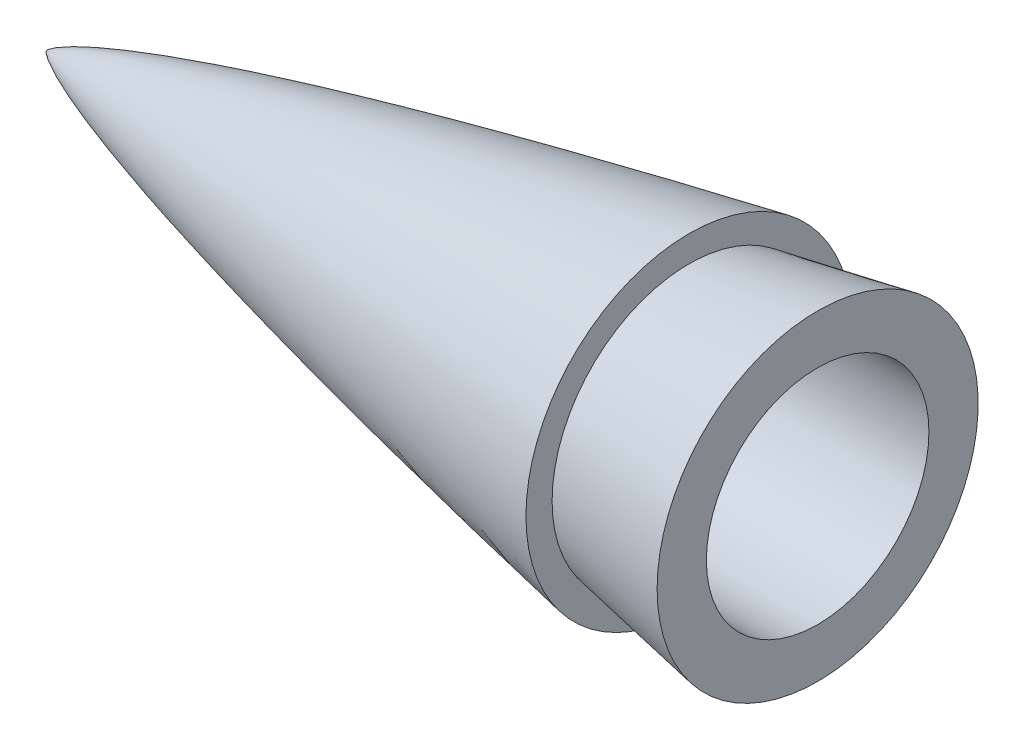
ISO-10303-21;
HEADER;
FILE_DESCRIPTION(('STEP AP214'),'2;1');
FILE_NAME('part.step','',(''),(''),'','','');
FILE_SCHEMA(('AUTOMOTIVE_DESIGN { 1 0 10303 214 1 1 1 1 }'));
ENDSEC;
DATA;
#1=APPLICATION_CONTEXT('core data for automotive mechanical design processes');
#2=APPLICATION_PROTOCOL_DEFINITION('international standard','automotive_design',2000,#1);
#3=PRODUCT_CONTEXT('',#1,'mechanical');
#4=PRODUCT('Part','Part','',(#3));
#5=PRODUCT_RELATED_PRODUCT_CATEGORY('part','',(#4));
#6=PRODUCT_DEFINITION_FORMATION('','',#4);
#7=PRODUCT_DEFINITION_CONTEXT('part definition',#1,'design');
#8=PRODUCT_DEFINITION('design','',#6,#7);
#9=PRODUCT_DEFINITION_SHAPE('','',#8);
#10=(LENGTH_UNIT() NAMED_UNIT(*) SI_UNIT(.MILLI.,.METRE.));
#11=(NAMED_UNIT(*) PLANE_ANGLE_UNIT() SI_UNIT($,.RADIAN.));
#12=(NAMED_UNIT(*) SI_UNIT($,.STERADIAN.) SOLID_ANGLE_UNIT());
#13=UNCERTAINTY_MEASURE_WITH_UNIT(LENGTH_MEASURE(1.E-05),#10,'distance_accuracy_value','');
#14=(GEOMETRIC_REPRESENTATION_CONTEXT(3) GLOBAL_UNCERTAINTY_ASSIGNED_CONTEXT((#13)) GLOBAL_UNIT_ASSIGNED_CONTEXT((#10,
#11,#12)) REPRESENTATION_CONTEXT('',''));
#15=CARTESIAN_POINT('',(0.,0.,0.));
#16=DIRECTION('',(0.,0.,1.));
#17=DIRECTION('',(1.,0.,0.));
#18=AXIS2_PLACEMENT_3D('',#15,#16,#17);
#19=CARTESIAN_POINT('',(0.,0.,0.));
#20=DIRECTION('',(-1.,0.,0.));
#21=DIRECTION('',(0.,0.,1.));
#22=AXIS2_PLACEMENT_3D('',#19,#20,#21);
#23=CYLINDRICAL_SURFACE('',#22,8.65540899578554);
#24=CARTESIAN_POINT('',(39.6893615911599,0.,0.));
#25=DIRECTION('',(-1.,0.,0.));
#26=DIRECTION('',(0.,0.,1.));
#27=AXIS2_PLACEMENT_3D('',#24,#25,#26);
#28=CIRCLE('',#27,8.65540899578553);
#29=CARTESIAN_POINT('',(39.6893615911599,0.,8.65540899578553));
#30=VERTEX_POINT('',#29);
#31=EDGE_CURVE('E68',#30,#30,#28,.T.);
#32=ORIENTED_EDGE('',*,*,#31,.T.);
#33=EDGE_LOOP('',(#32));
#34=FACE_BOUND('',#33,.T.);
#35=CARTESIAN_POINT('',(60.,0.,0.));
#36=DIRECTION('',(-1.,0.,0.));
#37=DIRECTION('',(0.,0.,1.));
#38=AXIS2_PLACEMENT_3D('',#35,#36,#37);
#39=CIRCLE('',#38,8.65540899578554);
#40=CARTESIAN_POINT('',(60.,0.,8.65540899578554));
#41=VERTEX_POINT('',#40);
#42=EDGE_CURVE('E11',#41,#41,#39,.T.);
#43=ORIENTED_EDGE('',*,*,#42,.F.);
#44=EDGE_LOOP('',(#43));
#45=FACE_BOUND('',#44,.T.);
#46=ADVANCED_FACE('F33',(#34,#45),#23,.F.);
#47=CARTESIAN_POINT('',(60.0000000000039,8.65540899578554,0.));
#48=DIRECTION('',(-1.,0.,0.));
#49=DIRECTION('',(0.,0.,1.));
#50=AXIS2_PLACEMENT_3D('',#47,#48,#49);
#51=PLANE('',#50);
#52=CARTESIAN_POINT('',(60.0000000000078,0.,0.));
#53=DIRECTION('',(-1.,0.,0.));
#54=DIRECTION('',(0.,0.,1.));
#55=AXIS2_PLACEMENT_3D('',#52,#53,#54);
#56=CIRCLE('',#55,12.4875000018693);
#57=CARTESIAN_POINT('',(60.0000000000078,0.,12.4875000018693));
#58=VERTEX_POINT('',#57);
#59=EDGE_CURVE('E40',#58,#58,#56,.T.);
#60=ORIENTED_EDGE('',*,*,#59,.F.);
#61=EDGE_LOOP('',(#60));
#62=FACE_BOUND('',#61,.T.);
#63=ORIENTED_EDGE('',*,*,#42,.T.);
#64=EDGE_LOOP('',(#63));
#65=FACE_BOUND('',#64,.T.);
#66=ADVANCED_FACE('F59',(#62,#65),#51,.F.);
#67=CARTESIAN_POINT('',(60.0000000000078,0.,0.));
#68=DIRECTION('',(1.,0.,0.));
#69=DIRECTION('',(0.,0.,-1.));
#70=AXIS2_PLACEMENT_3D('',#67,#68,#69);
#71=CONICAL_SURFACE('',#70,12.4875000018693,0.181199578845603);
#72=CARTESIAN_POINT('',(50.0000000000001,0.,0.));
#73=DIRECTION('',(-1.,0.,0.));
#74=DIRECTION('',(0.,0.,1.));
#75=AXIS2_PLACEMENT_3D('',#72,#73,#74);
#76=CIRCLE('',#75,10.6554089957855);
#77=CARTESIAN_POINT('',(50.0000000000001,0.,10.6554089957855));
#78=VERTEX_POINT('',#77);
#79=EDGE_CURVE('E74',#78,#78,#76,.T.);
#80=ORIENTED_EDGE('',*,*,#79,.F.);
#81=EDGE_LOOP('',(#80));
#82=FACE_BOUND('',#81,.T.);
#83=ORIENTED_EDGE('',*,*,#59,.T.);
#84=EDGE_LOOP('',(#83));
#85=FACE_BOUND('',#84,.T.);
#86=ADVANCED_FACE('F64',(#82,#85),#71,.T.);
#87=CARTESIAN_POINT('',(50.0000000000001,10.6554089957855,0.));
#88=DIRECTION('',(-1.,0.,0.));
#89=DIRECTION('',(0.,0.,1.));
#90=AXIS2_PLACEMENT_3D('',#87,#88,#89);
#91=PLANE('',#90);
#92=CARTESIAN_POINT('',(50.,0.,0.));
#93=DIRECTION('',(-1.,0.,0.));
#94=DIRECTION('',(0.,0.,1.));
#95=AXIS2_PLACEMENT_3D('',#92,#93,#94);
#96=CIRCLE('',#95,12.690393654996);
#97=CARTESIAN_POINT('',(50.,0.,12.690393654996));
#98=VERTEX_POINT('',#97);
#99=EDGE_CURVE('E71',#98,#98,#96,.T.);
#100=ORIENTED_EDGE('',*,*,#99,.F.);
#101=EDGE_LOOP('',(#100));
#102=FACE_BOUND('',#101,.T.);
#103=ORIENTED_EDGE('',*,*,#79,.T.);
#104=EDGE_LOOP('',(#103));
#105=FACE_BOUND('',#104,.T.);
#106=ADVANCED_FACE('F54',(#102,#105),#91,.F.);
#107=CARTESIAN_POINT('',(0.,0.,0.));
#108=CARTESIAN_POINT('',(0.00266136900278421,0.00735768035447365,0.));
#109=CARTESIAN_POINT('',(0.00910866427944121,0.0214551764039748,0.));
#110=CARTESIAN_POINT('',(0.0268587388071416,0.0470228254409732,0.));
#111=CARTESIAN_POINT('',(0.068419249644177,0.093346235258359,0.));
#112=CARTESIAN_POINT('',(0.131428409377906,0.151025199859621,0.));
#113=CARTESIAN_POINT('',(0.216810716078594,0.218337029592314,0.));
#114=CARTESIAN_POINT('',(0.338162363800073,0.304110587338518,0.));
#115=CARTESIAN_POINT('',(0.483942430084813,0.397396691898665,0.));
#116=CARTESIAN_POINT('',(0.655054984604438,0.498068807239349,0.));
#117=CARTESIAN_POINT('',(0.851568564991908,0.605626997792388,0.));
#118=CARTESIAN_POINT('',(1.13765450888636,0.7533505277805,0.));
#119=CARTESIAN_POINT('',(1.58154368184049,0.966113556130806,0.));
#120=CARTESIAN_POINT('',(2.33505073344386,1.29612267156492,0.));
#121=CARTESIAN_POINT('',(3.68290156650669,1.82662928309065,0.));
#122=CARTESIAN_POINT('',(6.11147325185707,2.67447630921792,0.));
#123=CARTESIAN_POINT('',(10.5746283005517,4.03796826352014,0.));
#124=CARTESIAN_POINT('',(18.9517337425947,6.25200129558947,0.));
#125=CARTESIAN_POINT('',(29.8190452299277,8.71511458343805,0.));
#126=CARTESIAN_POINT('',(39.484763039241,10.6852035454768,0.));
#127=CARTESIAN_POINT('',(46.8939191312946,12.1074881240001,0.));
#128=CARTESIAN_POINT('',(50.,12.690393654996,0.));
#129=B_SPLINE_CURVE_WITH_KNOTS('',4,(#107,#108,#109,#110,#111,#112,#113,#114,#115,#116,#117,
#118,#119,#120,#121,#122,#123,#124,#125,#126,#127,#128),.UNSPECIFIED.,.F.,.F.,(5,1,1,1,1,1,1,1,
1,1,1,1,1,1,1,1,1,1,5),(0.,4.11032787983853E-05,8.22065575967706E-05,0.000164413115193541,
0.000328826230387082,0.000493239345580623,0.000657652460774165,0.000951493612859079,
0.00124533476494399,0.00154479174871456,0.00184424873248513,0.00265705719597522,
0.00385252046802978,0.00590167698954035,0.00951586252134179,0.0162807635228404,
0.0285690036013013,0.0517938037720722,0.0685356021373789),.UNSPECIFIED.);
#130=CARTESIAN_POINT('',(0.,0.,0.));
#131=DIRECTION('',(-1.,0.,0.));
#132=AXIS1_PLACEMENT('',#130,#131);
#133=SURFACE_OF_REVOLUTION('',#129,#132);
#134=ORIENTED_EDGE('',*,*,#99,.T.);
#135=EDGE_LOOP('',(#134));
#136=FACE_BOUND('',#135,.T.);
#137=CARTESIAN_POINT('',(0.,0.,0.));
#138=VERTEX_POINT('',#137);
#139=VERTEX_LOOP('',#138);
#140=FACE_BOUND('',#139,.T.);
#141=ADVANCED_FACE('F48',(#136,#140),#133,.F.);
#142=CARTESIAN_POINT('',(4.55255559662686,0.,0.));
#143=DIRECTION('',(1.,0.,0.));
#144=DIRECTION('',(0.,0.,-1.));
#145=AXIS2_PLACEMENT_3D('',#142,#143,#144);
#146=CONICAL_SURFACE('',#145,0.,0.241525855667263);
#147=ORIENTED_EDGE('',*,*,#31,.F.);
#148=EDGE_LOOP('',(#147));
#149=FACE_BOUND('',#148,.T.);
#150=CARTESIAN_POINT('',(4.55255559662686,0.,0.));
#151=VERTEX_POINT('',#150);
#152=VERTEX_LOOP('',#151);
#153=FACE_BOUND('',#152,.T.);
#154=ADVANCED_FACE('F46',(#149,#153),#146,.F.);
#155=CLOSED_SHELL('',(#46,#66,#86,#106,#141,#154));
#156=MANIFOLD_SOLID_BREP('B2',#155);
#157=ADVANCED_BREP_SHAPE_REPRESENTATION('',(#18,#156),#14);
#158=SHAPE_DEFINITION_REPRESENTATION(#9,#157);
ENDSEC;
END-ISO-10303-21;
